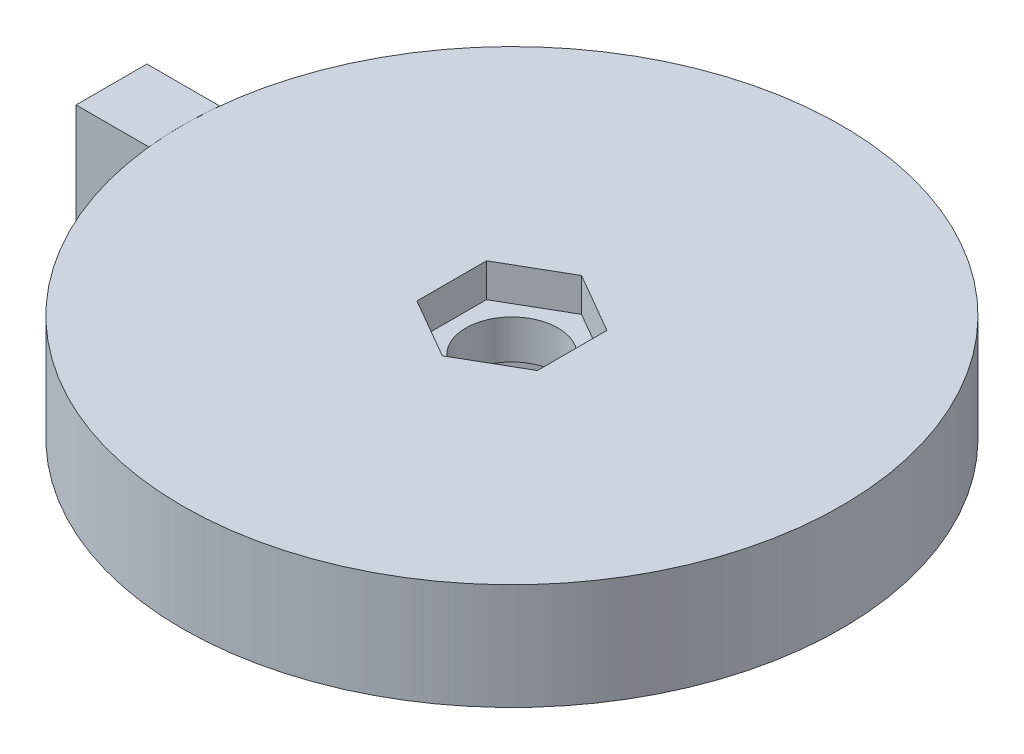
ISO-10303-21;
HEADER;
FILE_DESCRIPTION(('STEP AP214'),'2;1');
FILE_NAME('part.step','',(''),(''),'','','');
FILE_SCHEMA(('AUTOMOTIVE_DESIGN { 1 0 10303 214 1 1 1 1 }'));
ENDSEC;
DATA;
#1=APPLICATION_CONTEXT('core data for automotive mechanical design processes');
#2=APPLICATION_PROTOCOL_DEFINITION('international standard','automotive_design',2000,#1);
#3=PRODUCT_CONTEXT('',#1,'mechanical');
#4=PRODUCT('Part','Part','',(#3));
#5=PRODUCT_RELATED_PRODUCT_CATEGORY('part','',(#4));
#6=PRODUCT_DEFINITION_FORMATION('','',#4);
#7=PRODUCT_DEFINITION_CONTEXT('part definition',#1,'design');
#8=PRODUCT_DEFINITION('design','',#6,#7);
#9=PRODUCT_DEFINITION_SHAPE('','',#8);
#10=(LENGTH_UNIT() NAMED_UNIT(*) SI_UNIT(.MILLI.,.METRE.));
#11=(NAMED_UNIT(*) PLANE_ANGLE_UNIT() SI_UNIT($,.RADIAN.));
#12=(NAMED_UNIT(*) SI_UNIT($,.STERADIAN.) SOLID_ANGLE_UNIT());
#13=UNCERTAINTY_MEASURE_WITH_UNIT(LENGTH_MEASURE(1.E-05),#10,'distance_accuracy_value','');
#14=(GEOMETRIC_REPRESENTATION_CONTEXT(3) GLOBAL_UNCERTAINTY_ASSIGNED_CONTEXT((#13)) GLOBAL_UNIT_ASSIGNED_CONTEXT((#10,
#11,#12)) REPRESENTATION_CONTEXT('',''));
#15=CARTESIAN_POINT('',(0.,0.,0.));
#16=DIRECTION('',(0.,0.,1.));
#17=DIRECTION('',(1.,0.,0.));
#18=AXIS2_PLACEMENT_3D('',#15,#16,#17);
#19=CARTESIAN_POINT('',(-56.5,15.,0.));
#20=DIRECTION('',(-1.,0.,0.));
#21=DIRECTION('',(0.,0.,1.));
#22=AXIS2_PLACEMENT_3D('',#19,#20,#21);
#23=PLANE('',#22);
#24=DIRECTION('',(0.,0.,-1.));
#25=VECTOR('',#24,1.);
#26=CARTESIAN_POINT('',(-56.5,0.,0.));
#27=LINE('',#26,#25);
#28=CARTESIAN_POINT('',(-56.5,0.,5.));
#29=VERTEX_POINT('',#28);
#30=CARTESIAN_POINT('',(-56.5,0.,-5.));
#31=VERTEX_POINT('',#30);
#32=EDGE_CURVE('E112',#29,#31,#27,.T.);
#33=ORIENTED_EDGE('',*,*,#32,.F.);
#34=DIRECTION('',(0.,-1.,0.));
#35=VECTOR('',#34,1.);
#36=CARTESIAN_POINT('',(-56.5,15.,5.));
#37=LINE('',#36,#35);
#38=CARTESIAN_POINT('',(-56.5,15.,5.));
#39=VERTEX_POINT('',#38);
#40=EDGE_CURVE('E12',#39,#29,#37,.T.);
#41=ORIENTED_EDGE('',*,*,#40,.F.);
#42=DIRECTION('',(0.,0.,-1.));
#43=VECTOR('',#42,1.);
#44=CARTESIAN_POINT('',(-56.5,15.,0.));
#45=LINE('',#44,#43);
#46=CARTESIAN_POINT('',(-56.5,15.,-5.));
#47=VERTEX_POINT('',#46);
#48=EDGE_CURVE('E107',#39,#47,#45,.T.);
#49=ORIENTED_EDGE('',*,*,#48,.T.);
#50=DIRECTION('',(0.,-1.,0.));
#51=VECTOR('',#50,1.);
#52=CARTESIAN_POINT('',(-56.5,15.,-5.));
#53=LINE('',#52,#51);
#54=EDGE_CURVE('E50',#47,#31,#53,.T.);
#55=ORIENTED_EDGE('',*,*,#54,.T.);
#56=EDGE_LOOP('',(#33,#41,#49,#55));
#57=FACE_BOUND('',#56,.T.);
#58=ADVANCED_FACE('F47',(#57),#23,.T.);
#59=CARTESIAN_POINT('',(0.,15.,5.));
#60=DIRECTION('',(0.,0.,-1.));
#61=DIRECTION('',(-1.,0.,0.));
#62=AXIS2_PLACEMENT_3D('',#59,#60,#61);
#63=PLANE('',#62);
#64=DIRECTION('',(1.,0.,0.));
#65=VECTOR('',#64,1.);
#66=CARTESIAN_POINT('',(0.,0.,5.));
#67=LINE('',#66,#65);
#68=CARTESIAN_POINT('',(-46.2304012528552,0.,5.));
#69=VERTEX_POINT('',#68);
#70=EDGE_CURVE('E80',#29,#69,#67,.T.);
#71=ORIENTED_EDGE('',*,*,#70,.T.);
#72=DIRECTION('',(0.,-1.,0.));
#73=VECTOR('',#72,1.);
#74=CARTESIAN_POINT('',(-46.2304012528552,15.,5.));
#75=LINE('',#74,#73);
#76=CARTESIAN_POINT('',(-46.2304012528552,15.,5.));
#77=VERTEX_POINT('',#76);
#78=EDGE_CURVE('E56',#77,#69,#75,.T.);
#79=ORIENTED_EDGE('',*,*,#78,.F.);
#80=DIRECTION('',(1.,0.,0.));
#81=VECTOR('',#80,1.);
#82=CARTESIAN_POINT('',(0.,15.,5.));
#83=LINE('',#82,#81);
#84=EDGE_CURVE('E97',#39,#77,#83,.T.);
#85=ORIENTED_EDGE('',*,*,#84,.F.);
#86=ORIENTED_EDGE('',*,*,#40,.T.);
#87=EDGE_LOOP('',(#71,#79,#85,#86));
#88=FACE_BOUND('',#87,.T.);
#89=ADVANCED_FACE('F122',(#88),#63,.F.);
#90=CARTESIAN_POINT('',(0.,15.,0.));
#91=DIRECTION('',(0.,-1.,0.));
#92=DIRECTION('',(0.,0.,-1.));
#93=AXIS2_PLACEMENT_3D('',#90,#91,#92);
#94=CYLINDRICAL_SURFACE('',#93,46.5);
#95=CARTESIAN_POINT('',(0.,0.,0.));
#96=DIRECTION('',(0.,-1.,0.));
#97=DIRECTION('',(0.,0.,-1.));
#98=AXIS2_PLACEMENT_3D('',#95,#96,#97);
#99=CIRCLE('',#98,46.5);
#100=CARTESIAN_POINT('',(-46.2304012528552,0.,-5.));
#101=VERTEX_POINT('',#100);
#102=EDGE_CURVE('E104',#69,#101,#99,.T.);
#103=ORIENTED_EDGE('',*,*,#102,.T.);
#104=DIRECTION('',(0.,-1.,0.));
#105=VECTOR('',#104,1.);
#106=CARTESIAN_POINT('',(-46.2304012528552,15.,-5.));
#107=LINE('',#106,#105);
#108=CARTESIAN_POINT('',(-46.2304012528552,15.,-5.));
#109=VERTEX_POINT('',#108);
#110=EDGE_CURVE('E101',#109,#101,#107,.T.);
#111=ORIENTED_EDGE('',*,*,#110,.F.);
#112=CARTESIAN_POINT('',(0.,15.,0.));
#113=DIRECTION('',(0.,-1.,0.));
#114=DIRECTION('',(0.,0.,-1.));
#115=AXIS2_PLACEMENT_3D('',#112,#113,#114);
#116=CIRCLE('',#115,46.5);
#117=EDGE_CURVE('E92',#77,#109,#116,.T.);
#118=ORIENTED_EDGE('',*,*,#117,.F.);
#119=ORIENTED_EDGE('',*,*,#78,.T.);
#120=EDGE_LOOP('',(#103,#111,#118,#119));
#121=FACE_BOUND('',#120,.T.);
#122=ADVANCED_FACE('F102',(#121),#94,.F.);
#123=CARTESIAN_POINT('',(0.,15.,-5.));
#124=DIRECTION('',(0.,0.,-1.));
#125=DIRECTION('',(-1.,0.,0.));
#126=AXIS2_PLACEMENT_3D('',#123,#124,#125);
#127=PLANE('',#126);
#128=DIRECTION('',(1.,0.,0.));
#129=VECTOR('',#128,1.);
#130=CARTESIAN_POINT('',(0.,0.,-5.));
#131=LINE('',#130,#129);
#132=EDGE_CURVE('E115',#31,#101,#131,.T.);
#133=ORIENTED_EDGE('',*,*,#132,.F.);
#134=ORIENTED_EDGE('',*,*,#54,.F.);
#135=DIRECTION('',(1.,0.,0.));
#136=VECTOR('',#135,1.);
#137=CARTESIAN_POINT('',(0.,15.,-5.));
#138=LINE('',#137,#136);
#139=EDGE_CURVE('E96',#47,#109,#138,.T.);
#140=ORIENTED_EDGE('',*,*,#139,.T.);
#141=ORIENTED_EDGE('',*,*,#110,.T.);
#142=EDGE_LOOP('',(#133,#134,#140,#141));
#143=FACE_BOUND('',#142,.T.);
#144=ADVANCED_FACE('F106',(#143),#127,.T.);
#145=CARTESIAN_POINT('',(0.,15.,0.));
#146=DIRECTION('',(0.,-1.,0.));
#147=DIRECTION('',(0.,0.,-1.));
#148=AXIS2_PLACEMENT_3D('',#145,#146,#147);
#149=PLANE('',#148);
#150=ORIENTED_EDGE('',*,*,#48,.F.);
#151=ORIENTED_EDGE('',*,*,#84,.T.);
#152=ORIENTED_EDGE('',*,*,#117,.T.);
#153=ORIENTED_EDGE('',*,*,#139,.F.);
#154=EDGE_LOOP('',(#150,#151,#152,#153));
#155=FACE_BOUND('',#154,.T.);
#156=ADVANCED_FACE('F95',(#155),#149,.F.);
#157=CARTESIAN_POINT('',(0.,0.,0.));
#158=DIRECTION('',(0.,-1.,0.));
#159=DIRECTION('',(0.,0.,-1.));
#160=AXIS2_PLACEMENT_3D('',#157,#158,#159);
#161=PLANE('',#160);
#162=ORIENTED_EDGE('',*,*,#32,.T.);
#163=ORIENTED_EDGE('',*,*,#132,.T.);
#164=ORIENTED_EDGE('',*,*,#102,.F.);
#165=ORIENTED_EDGE('',*,*,#70,.F.);
#166=EDGE_LOOP('',(#162,#163,#164,#165));
#167=FACE_BOUND('',#166,.T.);
#168=ADVANCED_FACE('F120',(#167),#161,.T.);
#169=CLOSED_SHELL('',(#58,#89,#122,#144,#156,#168));
#170=MANIFOLD_SOLID_BREP('B2',#169);
#171=CARTESIAN_POINT('',(0.,0.,0.));
#172=DIRECTION('',(0.,1.,0.));
#173=DIRECTION('',(0.,0.,1.));
#174=AXIS2_PLACEMENT_3D('',#171,#172,#173);
#175=PLANE('',#174);
#176=CARTESIAN_POINT('',(0.,0.,0.));
#177=DIRECTION('',(0.,1.,0.));
#178=DIRECTION('',(0.,0.,1.));
#179=AXIS2_PLACEMENT_3D('',#176,#177,#178);
#180=CIRCLE('',#179,46.5);
#181=CARTESIAN_POINT('',(0.,0.,46.5));
#182=VERTEX_POINT('',#181);
#183=EDGE_CURVE('E189',#182,#182,#180,.T.);
#184=ORIENTED_EDGE('',*,*,#183,.F.);
#185=EDGE_LOOP('',(#184));
#186=FACE_BOUND('',#185,.T.);
#187=DIRECTION('',(-0.866025403784439,0.,0.5));
#188=VECTOR('',#187,1.);
#189=CARTESIAN_POINT('',(0.,0.,-9.81495457622362));
#190=LINE('',#189,#188);
#191=CARTESIAN_POINT('',(0.,0.,-9.81495457622362));
#192=VERTEX_POINT('',#191);
#193=CARTESIAN_POINT('',(-8.5,0.,-4.90747728811182));
#194=VERTEX_POINT('',#193);
#195=EDGE_CURVE('E197',#192,#194,#190,.T.);
#196=ORIENTED_EDGE('',*,*,#195,.T.);
#197=DIRECTION('',(0.,0.,1.));
#198=VECTOR('',#197,1.);
#199=CARTESIAN_POINT('',(-8.5,0.,-4.90747728811182));
#200=LINE('',#199,#198);
#201=CARTESIAN_POINT('',(-8.5,0.,4.90747728811182));
#202=VERTEX_POINT('',#201);
#203=EDGE_CURVE('E293',#194,#202,#200,.T.);
#204=ORIENTED_EDGE('',*,*,#203,.T.);
#205=DIRECTION('',(0.866025403784438,0.,0.5));
#206=VECTOR('',#205,1.);
#207=CARTESIAN_POINT('',(-8.5,0.,4.90747728811182));
#208=LINE('',#207,#206);
#209=CARTESIAN_POINT('',(0.,0.,9.81495457622364));
#210=VERTEX_POINT('',#209);
#211=EDGE_CURVE('E384',#202,#210,#208,.T.);
#212=ORIENTED_EDGE('',*,*,#211,.T.);
#213=DIRECTION('',(0.866025403784438,0.,-0.5));
#214=VECTOR('',#213,1.);
#215=CARTESIAN_POINT('',(0.,0.,9.81495457622364));
#216=LINE('',#215,#214);
#217=CARTESIAN_POINT('',(8.5,0.,4.90747728811182));
#218=VERTEX_POINT('',#217);
#219=EDGE_CURVE('E391',#210,#218,#216,.T.);
#220=ORIENTED_EDGE('',*,*,#219,.T.);
#221=DIRECTION('',(0.,0.,-1.));
#222=VECTOR('',#221,1.);
#223=CARTESIAN_POINT('',(8.5,0.,4.90747728811182));
#224=LINE('',#223,#222);
#225=CARTESIAN_POINT('',(8.5,0.,-4.90747728811179));
#226=VERTEX_POINT('',#225);
#227=EDGE_CURVE('E394',#218,#226,#224,.T.);
#228=ORIENTED_EDGE('',*,*,#227,.T.);
#229=DIRECTION('',(-0.866025403784439,0.,-0.5));
#230=VECTOR('',#229,1.);
#231=CARTESIAN_POINT('',(8.5,0.,-4.90747728811179));
#232=LINE('',#231,#230);
#233=EDGE_CURVE('E289',#226,#192,#232,.T.);
#234=ORIENTED_EDGE('',*,*,#233,.T.);
#235=EDGE_LOOP('',(#196,#204,#212,#220,#228,#234));
#236=FACE_BOUND('',#235,.T.);
#237=ADVANCED_FACE('F180',(#186,#236),#175,.F.);
#238=CARTESIAN_POINT('',(0.,0.,0.));
#239=DIRECTION('',(0.,1.,0.));
#240=DIRECTION('',(0.,0.,1.));
#241=AXIS2_PLACEMENT_3D('',#238,#239,#240);
#242=CYLINDRICAL_SURFACE('',#241,6.5);
#243=CARTESIAN_POINT('',(0.,4.75,0.));
#244=DIRECTION('',(0.,1.,0.));
#245=DIRECTION('',(0.,0.,1.));
#246=AXIS2_PLACEMENT_3D('',#243,#244,#245);
#247=CIRCLE('',#246,6.5);
#248=CARTESIAN_POINT('',(0.,4.75,6.5));
#249=VERTEX_POINT('',#248);
#250=EDGE_CURVE('E184',#249,#249,#247,.F.);
#251=ORIENTED_EDGE('',*,*,#250,.T.);
#252=EDGE_LOOP('',(#251));
#253=FACE_BOUND('',#252,.T.);
#254=CARTESIAN_POINT('',(0.,10.25,0.));
#255=DIRECTION('',(0.,1.,0.));
#256=DIRECTION('',(0.,0.,1.));
#257=AXIS2_PLACEMENT_3D('',#254,#255,#256);
#258=CIRCLE('',#257,6.5);
#259=CARTESIAN_POINT('',(0.,10.25,6.5));
#260=VERTEX_POINT('',#259);
#261=EDGE_CURVE('E332',#260,#260,#258,.F.);
#262=ORIENTED_EDGE('',*,*,#261,.F.);
#263=EDGE_LOOP('',(#262));
#264=FACE_BOUND('',#263,.T.);
#265=ADVANCED_FACE('F348',(#253,#264),#242,.F.);
#266=CARTESIAN_POINT('',(0.,15.,0.));
#267=DIRECTION('',(0.,-1.,0.));
#268=DIRECTION('',(0.,0.,-1.));
#269=AXIS2_PLACEMENT_3D('',#266,#267,#268);
#270=CYLINDRICAL_SURFACE('',#269,46.5);
#271=CARTESIAN_POINT('',(0.,15.,0.));
#272=DIRECTION('',(0.,1.,0.));
#273=DIRECTION('',(0.,0.,1.));
#274=AXIS2_PLACEMENT_3D('',#271,#272,#273);
#275=CIRCLE('',#274,46.5);
#276=CARTESIAN_POINT('',(0.,15.,46.5));
#277=VERTEX_POINT('',#276);
#278=EDGE_CURVE('E45',#277,#277,#275,.T.);
#279=ORIENTED_EDGE('',*,*,#278,.F.);
#280=EDGE_LOOP('',(#279));
#281=FACE_BOUND('',#280,.T.);
#282=ORIENTED_EDGE('',*,*,#183,.T.);
#283=EDGE_LOOP('',(#282));
#284=FACE_BOUND('',#283,.T.);
#285=ADVANCED_FACE('F182',(#281,#284),#270,.T.);
#286=CARTESIAN_POINT('',(0.,15.,0.));
#287=DIRECTION('',(0.,1.,0.));
#288=DIRECTION('',(0.,0.,1.));
#289=AXIS2_PLACEMENT_3D('',#286,#287,#288);
#290=PLANE('',#289);
#291=DIRECTION('',(0.,0.,-1.));
#292=VECTOR('',#291,1.);
#293=CARTESIAN_POINT('',(8.5,15.,4.90747728811182));
#294=LINE('',#293,#292);
#295=CARTESIAN_POINT('',(8.5,15.,4.90747728811182));
#296=VERTEX_POINT('',#295);
#297=CARTESIAN_POINT('',(8.5,15.,-4.90747728811179));
#298=VERTEX_POINT('',#297);
#299=EDGE_CURVE('E306',#296,#298,#294,.T.);
#300=ORIENTED_EDGE('',*,*,#299,.F.);
#301=DIRECTION('',(0.866025403784438,0.,-0.500000000000001));
#302=VECTOR('',#301,1.);
#303=CARTESIAN_POINT('',(4.25000000000001,15.,7.36121593216773));
#304=LINE('',#303,#302);
#305=CARTESIAN_POINT('',(0.,15.,9.81495457622364));
#306=VERTEX_POINT('',#305);
#307=EDGE_CURVE('E326',#306,#296,#304,.T.);
#308=ORIENTED_EDGE('',*,*,#307,.F.);
#309=DIRECTION('',(0.866025403784439,0.,0.5));
#310=VECTOR('',#309,1.);
#311=CARTESIAN_POINT('',(-4.25,15.,7.36121593216773));
#312=LINE('',#311,#310);
#313=CARTESIAN_POINT('',(-8.5,15.,4.90747728811182));
#314=VERTEX_POINT('',#313);
#315=EDGE_CURVE('E323',#314,#306,#312,.T.);
#316=ORIENTED_EDGE('',*,*,#315,.F.);
#317=DIRECTION('',(0.,0.,1.));
#318=VECTOR('',#317,1.);
#319=CARTESIAN_POINT('',(-8.5,15.,0.));
#320=LINE('',#319,#318);
#321=CARTESIAN_POINT('',(-8.5,15.,-4.90747728811182));
#322=VERTEX_POINT('',#321);
#323=EDGE_CURVE('E320',#322,#314,#320,.T.);
#324=ORIENTED_EDGE('',*,*,#323,.F.);
#325=DIRECTION('',(-0.866025403784439,0.,0.499999999999999));
#326=VECTOR('',#325,1.);
#327=CARTESIAN_POINT('',(-4.25,15.,-7.36121593216772));
#328=LINE('',#327,#326);
#329=CARTESIAN_POINT('',(0.,15.,-9.81495457622362));
#330=VERTEX_POINT('',#329);
#331=EDGE_CURVE('E317',#330,#322,#328,.T.);
#332=ORIENTED_EDGE('',*,*,#331,.F.);
#333=DIRECTION('',(-0.866025403784439,0.,-0.5));
#334=VECTOR('',#333,1.);
#335=CARTESIAN_POINT('',(4.25000000000002,15.,-7.36121593216769));
#336=LINE('',#335,#334);
#337=EDGE_CURVE('E297',#298,#330,#336,.T.);
#338=ORIENTED_EDGE('',*,*,#337,.F.);
#339=EDGE_LOOP('',(#300,#308,#316,#324,#332,#338));
#340=FACE_BOUND('',#339,.T.);
#341=ORIENTED_EDGE('',*,*,#278,.T.);
#342=EDGE_LOOP('',(#341));
#343=FACE_BOUND('',#342,.T.);
#344=ADVANCED_FACE('F356',(#340,#343),#290,.T.);
#345=CARTESIAN_POINT('',(0.,10.25,0.));
#346=DIRECTION('',(0.,1.,0.));
#347=DIRECTION('',(0.,0.,1.));
#348=AXIS2_PLACEMENT_3D('',#345,#346,#347);
#349=PLANE('',#348);
#350=DIRECTION('',(0.,0.,-1.));
#351=VECTOR('',#350,1.);
#352=CARTESIAN_POINT('',(8.5,10.25,0.));
#353=LINE('',#352,#351);
#354=CARTESIAN_POINT('',(8.5,10.25,4.90747728811182));
#355=VERTEX_POINT('',#354);
#356=CARTESIAN_POINT('',(8.5,10.25,-4.90747728811183));
#357=VERTEX_POINT('',#356);
#358=EDGE_CURVE('E302',#355,#357,#353,.T.);
#359=ORIENTED_EDGE('',*,*,#358,.T.);
#360=DIRECTION('',(-0.866025403784442,0.,-0.499999999999994));
#361=VECTOR('',#360,1.);
#362=CARTESIAN_POINT('',(8.5,10.25,-4.90747728811183));
#363=LINE('',#362,#361);
#364=CARTESIAN_POINT('',(0.,10.25,-9.81495457622362));
#365=VERTEX_POINT('',#364);
#366=EDGE_CURVE('E305',#357,#365,#363,.T.);
#367=ORIENTED_EDGE('',*,*,#366,.T.);
#368=DIRECTION('',(-0.866025403784439,0.,0.5));
#369=VECTOR('',#368,1.);
#370=CARTESIAN_POINT('',(0.,10.25,-9.81495457622362));
#371=LINE('',#370,#369);
#372=CARTESIAN_POINT('',(-8.5,10.25,-4.90747728811182));
#373=VERTEX_POINT('',#372);
#374=EDGE_CURVE('E308',#365,#373,#371,.T.);
#375=ORIENTED_EDGE('',*,*,#374,.T.);
#376=DIRECTION('',(0.,0.,1.));
#377=VECTOR('',#376,1.);
#378=CARTESIAN_POINT('',(-8.5,10.25,-4.90747728811182));
#379=LINE('',#378,#377);
#380=CARTESIAN_POINT('',(-8.5,10.25,4.90747728811182));
#381=VERTEX_POINT('',#380);
#382=EDGE_CURVE('E310',#373,#381,#379,.T.);
#383=ORIENTED_EDGE('',*,*,#382,.T.);
#384=DIRECTION('',(0.866025403784439,0.,0.5));
#385=VECTOR('',#384,1.);
#386=CARTESIAN_POINT('',(-8.5,10.25,4.90747728811182));
#387=LINE('',#386,#385);
#388=CARTESIAN_POINT('',(0.,10.25,9.81495457622364));
#389=VERTEX_POINT('',#388);
#390=EDGE_CURVE('E312',#381,#389,#387,.T.);
#391=ORIENTED_EDGE('',*,*,#390,.T.);
#392=DIRECTION('',(0.866025403784439,0.,-0.5));
#393=VECTOR('',#392,1.);
#394=CARTESIAN_POINT('',(0.,10.25,9.81495457622364));
#395=LINE('',#394,#393);
#396=EDGE_CURVE('E314',#389,#355,#395,.T.);
#397=ORIENTED_EDGE('',*,*,#396,.T.);
#398=EDGE_LOOP('',(#359,#367,#375,#383,#391,#397));
#399=FACE_BOUND('',#398,.T.);
#400=ORIENTED_EDGE('',*,*,#261,.T.);
#401=EDGE_LOOP('',(#400));
#402=FACE_BOUND('',#401,.T.);
#403=ADVANCED_FACE('F346',(#399,#402),#349,.T.);
#404=CARTESIAN_POINT('',(8.5,10.25,4.90747728811182));
#405=DIRECTION('',(1.,0.,0.));
#406=DIRECTION('',(0.,0.,-1.));
#407=AXIS2_PLACEMENT_3D('',#404,#405,#406);
#408=PLANE('',#407);
#409=ORIENTED_EDGE('',*,*,#299,.T.);
#410=DIRECTION('',(0.,1.,0.));
#411=VECTOR('',#410,1.);
#412=CARTESIAN_POINT('',(8.5,10.25,-4.90747728811183));
#413=LINE('',#412,#411);
#414=EDGE_CURVE('E205',#357,#298,#413,.T.);
#415=ORIENTED_EDGE('',*,*,#414,.F.);
#416=ORIENTED_EDGE('',*,*,#358,.F.);
#417=DIRECTION('',(0.,1.,0.));
#418=VECTOR('',#417,1.);
#419=CARTESIAN_POINT('',(8.5,10.25,4.90747728811182));
#420=LINE('',#419,#418);
#421=EDGE_CURVE('E330',#355,#296,#420,.T.);
#422=ORIENTED_EDGE('',*,*,#421,.T.);
#423=EDGE_LOOP('',(#409,#415,#416,#422));
#424=FACE_BOUND('',#423,.T.);
#425=ADVANCED_FACE('F368',(#424),#408,.F.);
#426=CARTESIAN_POINT('',(4.25000000000001,10.25,7.36121593216773));
#427=DIRECTION('',(0.500000000000001,0.,0.866025403784438));
#428=DIRECTION('',(0.866025403784438,0.,-0.500000000000001));
#429=AXIS2_PLACEMENT_3D('',#426,#427,#428);
#430=PLANE('',#429);
#431=ORIENTED_EDGE('',*,*,#307,.T.);
#432=ORIENTED_EDGE('',*,*,#421,.F.);
#433=ORIENTED_EDGE('',*,*,#396,.F.);
#434=DIRECTION('',(0.,1.,0.));
#435=VECTOR('',#434,1.);
#436=CARTESIAN_POINT('',(0.,10.25,9.81495457622364));
#437=LINE('',#436,#435);
#438=EDGE_CURVE('E333',#389,#306,#437,.T.);
#439=ORIENTED_EDGE('',*,*,#438,.T.);
#440=EDGE_LOOP('',(#431,#432,#433,#439));
#441=FACE_BOUND('',#440,.T.);
#442=ADVANCED_FACE('F438',(#441),#430,.F.);
#443=CARTESIAN_POINT('',(-4.25,10.25,7.36121593216773));
#444=DIRECTION('',(-0.5,0.,0.866025403784439));
#445=DIRECTION('',(0.866025403784439,0.,0.5));
#446=AXIS2_PLACEMENT_3D('',#443,#444,#445);
#447=PLANE('',#446);
#448=ORIENTED_EDGE('',*,*,#315,.T.);
#449=ORIENTED_EDGE('',*,*,#438,.F.);
#450=ORIENTED_EDGE('',*,*,#390,.F.);
#451=DIRECTION('',(0.,1.,0.));
#452=VECTOR('',#451,1.);
#453=CARTESIAN_POINT('',(-8.5,10.25,4.90747728811182));
#454=LINE('',#453,#452);
#455=EDGE_CURVE('E335',#381,#314,#454,.T.);
#456=ORIENTED_EDGE('',*,*,#455,.T.);
#457=EDGE_LOOP('',(#448,#449,#450,#456));
#458=FACE_BOUND('',#457,.T.);
#459=ADVANCED_FACE('F442',(#458),#447,.F.);
#460=CARTESIAN_POINT('',(-8.5,10.25,0.));
#461=DIRECTION('',(-1.,0.,0.));
#462=DIRECTION('',(0.,0.,1.));
#463=AXIS2_PLACEMENT_3D('',#460,#461,#462);
#464=PLANE('',#463);
#465=ORIENTED_EDGE('',*,*,#323,.T.);
#466=ORIENTED_EDGE('',*,*,#455,.F.);
#467=ORIENTED_EDGE('',*,*,#382,.F.);
#468=DIRECTION('',(0.,1.,0.));
#469=VECTOR('',#468,1.);
#470=CARTESIAN_POINT('',(-8.5,10.25,-4.90747728811182));
#471=LINE('',#470,#469);
#472=EDGE_CURVE('E337',#373,#322,#471,.T.);
#473=ORIENTED_EDGE('',*,*,#472,.T.);
#474=EDGE_LOOP('',(#465,#466,#467,#473));
#475=FACE_BOUND('',#474,.T.);
#476=ADVANCED_FACE('F446',(#475),#464,.F.);
#477=CARTESIAN_POINT('',(-4.25,10.25,-7.36121593216772));
#478=DIRECTION('',(-0.499999999999999,0.,-0.866025403784439));
#479=DIRECTION('',(-0.866025403784439,0.,0.499999999999999));
#480=AXIS2_PLACEMENT_3D('',#477,#478,#479);
#481=PLANE('',#480);
#482=ORIENTED_EDGE('',*,*,#331,.T.);
#483=ORIENTED_EDGE('',*,*,#472,.F.);
#484=ORIENTED_EDGE('',*,*,#374,.F.);
#485=DIRECTION('',(0.,1.,0.));
#486=VECTOR('',#485,1.);
#487=CARTESIAN_POINT('',(0.,10.25,-9.81495457622362));
#488=LINE('',#487,#486);
#489=EDGE_CURVE('E339',#365,#330,#488,.T.);
#490=ORIENTED_EDGE('',*,*,#489,.T.);
#491=EDGE_LOOP('',(#482,#483,#484,#490));
#492=FACE_BOUND('',#491,.T.);
#493=ADVANCED_FACE('F449',(#492),#481,.F.);
#494=CARTESIAN_POINT('',(4.25000000000002,10.25,-7.36121593216769));
#495=DIRECTION('',(0.5,0.,-0.866025403784439));
#496=DIRECTION('',(-0.866025403784439,0.,-0.5));
#497=AXIS2_PLACEMENT_3D('',#494,#495,#496);
#498=PLANE('',#497);
#499=ORIENTED_EDGE('',*,*,#337,.T.);
#500=ORIENTED_EDGE('',*,*,#489,.F.);
#501=ORIENTED_EDGE('',*,*,#366,.F.);
#502=ORIENTED_EDGE('',*,*,#414,.T.);
#503=EDGE_LOOP('',(#499,#500,#501,#502));
#504=FACE_BOUND('',#503,.T.);
#505=ADVANCED_FACE('F361',(#504),#498,.F.);
#506=CARTESIAN_POINT('',(0.,4.75,0.));
#507=DIRECTION('',(0.,1.,0.));
#508=DIRECTION('',(0.,0.,1.));
#509=AXIS2_PLACEMENT_3D('',#506,#507,#508);
#510=PLANE('',#509);
#511=DIRECTION('',(-0.866025403784439,0.,0.5));
#512=VECTOR('',#511,1.);
#513=CARTESIAN_POINT('',(0.,4.75,-9.81495457622362));
#514=LINE('',#513,#512);
#515=CARTESIAN_POINT('',(0.,4.75,-9.81495457622362));
#516=VERTEX_POINT('',#515);
#517=CARTESIAN_POINT('',(-8.5,4.75,-4.90747728811182));
#518=VERTEX_POINT('',#517);
#519=EDGE_CURVE('E279',#516,#518,#514,.T.);
#520=ORIENTED_EDGE('',*,*,#519,.F.);
#521=DIRECTION('',(-0.866025403784439,0.,-0.5));
#522=VECTOR('',#521,1.);
#523=CARTESIAN_POINT('',(8.5,4.75,-4.90747728811179));
#524=LINE('',#523,#522);
#525=CARTESIAN_POINT('',(8.5,4.75,-4.90747728811179));
#526=VERTEX_POINT('',#525);
#527=EDGE_CURVE('E387',#526,#516,#524,.T.);
#528=ORIENTED_EDGE('',*,*,#527,.F.);
#529=DIRECTION('',(0.,0.,-1.));
#530=VECTOR('',#529,1.);
#531=CARTESIAN_POINT('',(8.5,4.75,4.90747728811182));
#532=LINE('',#531,#530);
#533=CARTESIAN_POINT('',(8.5,4.75,4.90747728811182));
#534=VERTEX_POINT('',#533);
#535=EDGE_CURVE('E414',#534,#526,#532,.T.);
#536=ORIENTED_EDGE('',*,*,#535,.F.);
#537=DIRECTION('',(0.866025403784438,0.,-0.5));
#538=VECTOR('',#537,1.);
#539=CARTESIAN_POINT('',(0.,4.75,9.81495457622364));
#540=LINE('',#539,#538);
#541=CARTESIAN_POINT('',(0.,4.75,9.81495457622364));
#542=VERTEX_POINT('',#541);
#543=EDGE_CURVE('E417',#542,#534,#540,.T.);
#544=ORIENTED_EDGE('',*,*,#543,.F.);
#545=DIRECTION('',(0.866025403784438,0.,0.5));
#546=VECTOR('',#545,1.);
#547=CARTESIAN_POINT('',(-8.5,4.75,4.90747728811182));
#548=LINE('',#547,#546);
#549=CARTESIAN_POINT('',(-8.5,4.75,4.90747728811182));
#550=VERTEX_POINT('',#549);
#551=EDGE_CURVE('E281',#550,#542,#548,.T.);
#552=ORIENTED_EDGE('',*,*,#551,.F.);
#553=DIRECTION('',(0.,0.,1.));
#554=VECTOR('',#553,1.);
#555=CARTESIAN_POINT('',(-8.5,4.75,-4.90747728811182));
#556=LINE('',#555,#554);
#557=EDGE_CURVE('E274',#518,#550,#556,.T.);
#558=ORIENTED_EDGE('',*,*,#557,.F.);
#559=EDGE_LOOP('',(#520,#528,#536,#544,#552,#558));
#560=FACE_BOUND('',#559,.T.);
#561=ORIENTED_EDGE('',*,*,#250,.F.);
#562=EDGE_LOOP('',(#561));
#563=FACE_BOUND('',#562,.T.);
#564=ADVANCED_FACE('F276',(#560,#563),#510,.F.);
#565=CARTESIAN_POINT('',(0.,4.75,-9.81495457622362));
#566=DIRECTION('',(0.5,0.,0.866025403784439));
#567=DIRECTION('',(0.866025403784439,0.,-0.5));
#568=AXIS2_PLACEMENT_3D('',#565,#566,#567);
#569=PLANE('',#568);
#570=ORIENTED_EDGE('',*,*,#195,.F.);
#571=DIRECTION('',(0.,-1.,0.));
#572=VECTOR('',#571,1.);
#573=CARTESIAN_POINT('',(0.,4.75,-9.81495457622362));
#574=LINE('',#573,#572);
#575=EDGE_CURVE('E288',#516,#192,#574,.T.);
#576=ORIENTED_EDGE('',*,*,#575,.F.);
#577=ORIENTED_EDGE('',*,*,#519,.T.);
#578=DIRECTION('',(0.,-1.,0.));
#579=VECTOR('',#578,1.);
#580=CARTESIAN_POINT('',(-8.5,4.75,-4.90747728811182));
#581=LINE('',#580,#579);
#582=EDGE_CURVE('E287',#518,#194,#581,.T.);
#583=ORIENTED_EDGE('',*,*,#582,.T.);
#584=EDGE_LOOP('',(#570,#576,#577,#583));
#585=FACE_BOUND('',#584,.T.);
#586=ADVANCED_FACE('F286',(#585),#569,.T.);
#587=CARTESIAN_POINT('',(-8.5,4.75,-4.90747728811182));
#588=DIRECTION('',(1.,0.,0.));
#589=DIRECTION('',(0.,0.,-1.));
#590=AXIS2_PLACEMENT_3D('',#587,#588,#589);
#591=PLANE('',#590);
#592=ORIENTED_EDGE('',*,*,#203,.F.);
#593=ORIENTED_EDGE('',*,*,#582,.F.);
#594=ORIENTED_EDGE('',*,*,#557,.T.);
#595=DIRECTION('',(0.,-1.,0.));
#596=VECTOR('',#595,1.);
#597=CARTESIAN_POINT('',(-8.5,4.75,4.90747728811182));
#598=LINE('',#597,#596);
#599=EDGE_CURVE('E294',#550,#202,#598,.T.);
#600=ORIENTED_EDGE('',*,*,#599,.T.);
#601=EDGE_LOOP('',(#592,#593,#594,#600));
#602=FACE_BOUND('',#601,.T.);
#603=ADVANCED_FACE('F291',(#602),#591,.T.);
#604=CARTESIAN_POINT('',(-8.5,4.75,4.90747728811182));
#605=DIRECTION('',(0.5,0.,-0.866025403784439));
#606=DIRECTION('',(-0.866025403784439,0.,-0.5));
#607=AXIS2_PLACEMENT_3D('',#604,#605,#606);
#608=PLANE('',#607);
#609=ORIENTED_EDGE('',*,*,#211,.F.);
#610=ORIENTED_EDGE('',*,*,#599,.F.);
#611=ORIENTED_EDGE('',*,*,#551,.T.);
#612=DIRECTION('',(0.,-1.,0.));
#613=VECTOR('',#612,1.);
#614=CARTESIAN_POINT('',(0.,4.75,9.81495457622364));
#615=LINE('',#614,#613);
#616=EDGE_CURVE('E298',#542,#210,#615,.T.);
#617=ORIENTED_EDGE('',*,*,#616,.T.);
#618=EDGE_LOOP('',(#609,#610,#611,#617));
#619=FACE_BOUND('',#618,.T.);
#620=ADVANCED_FACE('F405',(#619),#608,.T.);
#621=CARTESIAN_POINT('',(0.,4.75,9.81495457622364));
#622=DIRECTION('',(-0.5,0.,-0.866025403784438));
#623=DIRECTION('',(-0.866025403784439,0.,0.5));
#624=AXIS2_PLACEMENT_3D('',#621,#622,#623);
#625=PLANE('',#624);
#626=ORIENTED_EDGE('',*,*,#219,.F.);
#627=ORIENTED_EDGE('',*,*,#616,.F.);
#628=ORIENTED_EDGE('',*,*,#543,.T.);
#629=DIRECTION('',(0.,-1.,0.));
#630=VECTOR('',#629,1.);
#631=CARTESIAN_POINT('',(8.5,4.75,4.90747728811182));
#632=LINE('',#631,#630);
#633=EDGE_CURVE('E400',#534,#218,#632,.T.);
#634=ORIENTED_EDGE('',*,*,#633,.T.);
#635=EDGE_LOOP('',(#626,#627,#628,#634));
#636=FACE_BOUND('',#635,.T.);
#637=ADVANCED_FACE('F407',(#636),#625,.T.);
#638=CARTESIAN_POINT('',(8.5,4.75,4.90747728811182));
#639=DIRECTION('',(-1.,0.,0.));
#640=DIRECTION('',(0.,0.,1.));
#641=AXIS2_PLACEMENT_3D('',#638,#639,#640);
#642=PLANE('',#641);
#643=ORIENTED_EDGE('',*,*,#227,.F.);
#644=ORIENTED_EDGE('',*,*,#633,.F.);
#645=ORIENTED_EDGE('',*,*,#535,.T.);
#646=DIRECTION('',(0.,-1.,0.));
#647=VECTOR('',#646,1.);
#648=CARTESIAN_POINT('',(8.5,4.75,-4.90747728811179));
#649=LINE('',#648,#647);
#650=EDGE_CURVE('E398',#526,#226,#649,.T.);
#651=ORIENTED_EDGE('',*,*,#650,.T.);
#652=EDGE_LOOP('',(#643,#644,#645,#651));
#653=FACE_BOUND('',#652,.T.);
#654=ADVANCED_FACE('F411',(#653),#642,.T.);
#655=CARTESIAN_POINT('',(8.5,4.75,-4.90747728811179));
#656=DIRECTION('',(-0.5,0.,0.866025403784439));
#657=DIRECTION('',(0.866025403784439,0.,0.5));
#658=AXIS2_PLACEMENT_3D('',#655,#656,#657);
#659=PLANE('',#658);
#660=ORIENTED_EDGE('',*,*,#233,.F.);
#661=ORIENTED_EDGE('',*,*,#650,.F.);
#662=ORIENTED_EDGE('',*,*,#527,.T.);
#663=ORIENTED_EDGE('',*,*,#575,.T.);
#664=EDGE_LOOP('',(#660,#661,#662,#663));
#665=FACE_BOUND('',#664,.T.);
#666=ADVANCED_FACE('F416',(#665),#659,.T.);
#667=CLOSED_SHELL('',(#237,#265,#285,#344,#403,#425,#442,#459,#476,#493,#505,#564,#586,#603,
#620,#637,#654,#666));
#668=MANIFOLD_SOLID_BREP('B6',#667);
#669=ADVANCED_BREP_SHAPE_REPRESENTATION('',(#18,#170,#668),#14);
#670=SHAPE_DEFINITION_REPRESENTATION(#9,#669);
ENDSEC;
END-ISO-10303-21;
